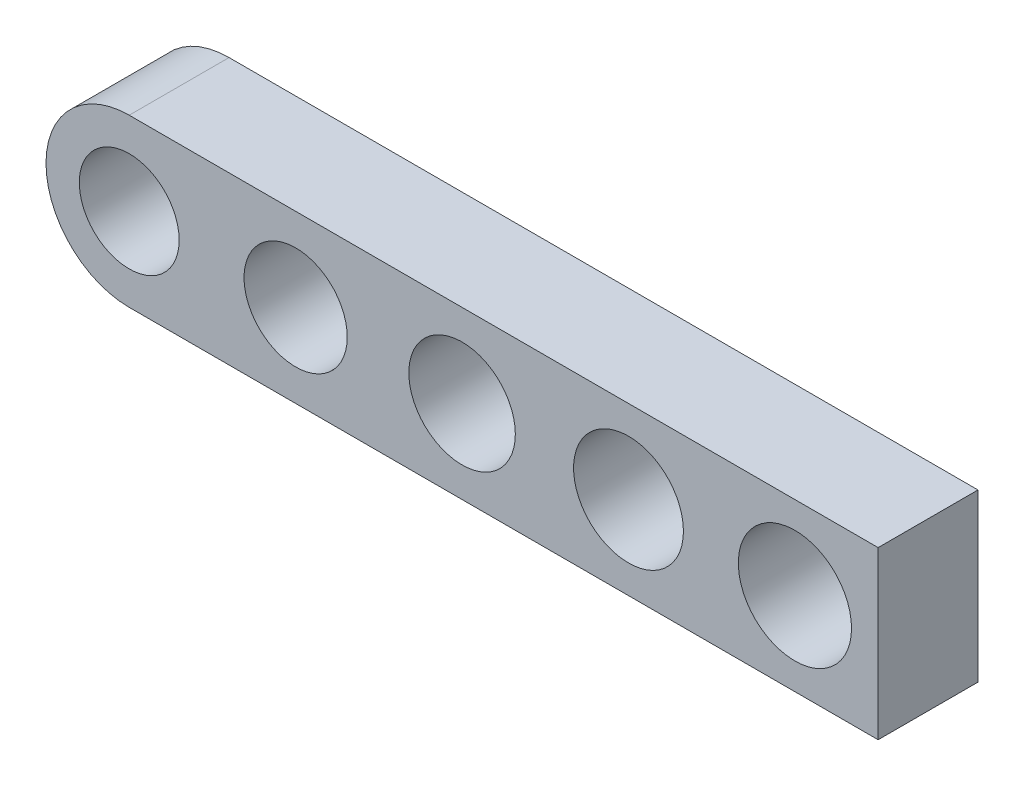
ISO-10303-21;
HEADER;
FILE_DESCRIPTION(('STEP AP214'),'2;1');
FILE_NAME('part.step','',(''),(''),'','','');
FILE_SCHEMA(('AUTOMOTIVE_DESIGN { 1 0 10303 214 1 1 1 1 }'));
ENDSEC;
DATA;
#1=APPLICATION_CONTEXT('core data for automotive mechanical design processes');
#2=APPLICATION_PROTOCOL_DEFINITION('international standard','automotive_design',2000,#1);
#3=PRODUCT_CONTEXT('',#1,'mechanical');
#4=PRODUCT('Part','Part','',(#3));
#5=PRODUCT_RELATED_PRODUCT_CATEGORY('part','',(#4));
#6=PRODUCT_DEFINITION_FORMATION('','',#4);
#7=PRODUCT_DEFINITION_CONTEXT('part definition',#1,'design');
#8=PRODUCT_DEFINITION('design','',#6,#7);
#9=PRODUCT_DEFINITION_SHAPE('','',#8);
#10=(LENGTH_UNIT() NAMED_UNIT(*) SI_UNIT(.MILLI.,.METRE.));
#11=(NAMED_UNIT(*) PLANE_ANGLE_UNIT() SI_UNIT($,.RADIAN.));
#12=(NAMED_UNIT(*) SI_UNIT($,.STERADIAN.) SOLID_ANGLE_UNIT());
#13=UNCERTAINTY_MEASURE_WITH_UNIT(LENGTH_MEASURE(1.E-05),#10,'distance_accuracy_value','');
#14=(GEOMETRIC_REPRESENTATION_CONTEXT(3) GLOBAL_UNCERTAINTY_ASSIGNED_CONTEXT((#13)) GLOBAL_UNIT_ASSIGNED_CONTEXT((#10,
#11,#12)) REPRESENTATION_CONTEXT('',''));
#15=CARTESIAN_POINT('',(0.,0.,0.));
#16=DIRECTION('',(0.,0.,1.));
#17=DIRECTION('',(1.,0.,0.));
#18=AXIS2_PLACEMENT_3D('',#15,#16,#17);
#19=CARTESIAN_POINT('',(0.,0.,3.));
#20=DIRECTION('',(0.,0.,1.));
#21=DIRECTION('',(1.,0.,0.));
#22=AXIS2_PLACEMENT_3D('',#19,#20,#21);
#23=PLANE('',#22);
#24=CARTESIAN_POINT('',(15.,0.,3.));
#25=DIRECTION('',(0.,0.,1.));
#26=DIRECTION('',(1.,0.,0.));
#27=AXIS2_PLACEMENT_3D('',#24,#25,#26);
#28=CIRCLE('',#27,1.65);
#29=CARTESIAN_POINT('',(16.65,0.,3.));
#30=VERTEX_POINT('',#29);
#31=EDGE_CURVE('E148',#30,#30,#28,.T.);
#32=ORIENTED_EDGE('',*,*,#31,.F.);
#33=EDGE_LOOP('',(#32));
#34=FACE_BOUND('',#33,.T.);
#35=CARTESIAN_POINT('',(5.,0.,3.));
#36=DIRECTION('',(0.,0.,1.));
#37=DIRECTION('',(1.,0.,0.));
#38=AXIS2_PLACEMENT_3D('',#35,#36,#37);
#39=CIRCLE('',#38,1.55);
#40=CARTESIAN_POINT('',(6.55,0.,3.));
#41=VERTEX_POINT('',#40);
#42=EDGE_CURVE('E132',#41,#41,#39,.T.);
#43=ORIENTED_EDGE('',*,*,#42,.F.);
#44=EDGE_LOOP('',(#43));
#45=FACE_BOUND('',#44,.T.);
#46=DIRECTION('',(0.,1.,0.));
#47=VECTOR('',#46,1.);
#48=CARTESIAN_POINT('',(22.5,-2.5,3.));
#49=LINE('',#48,#47);
#50=CARTESIAN_POINT('',(22.5,-2.5,3.));
#51=VERTEX_POINT('',#50);
#52=CARTESIAN_POINT('',(22.5,2.5,3.));
#53=VERTEX_POINT('',#52);
#54=EDGE_CURVE('E91',#51,#53,#49,.T.);
#55=ORIENTED_EDGE('',*,*,#54,.T.);
#56=DIRECTION('',(-1.,0.,0.));
#57=VECTOR('',#56,1.);
#58=CARTESIAN_POINT('',(17.5,2.5,3.));
#59=LINE('',#58,#57);
#60=CARTESIAN_POINT('',(0.,2.5,3.));
#61=VERTEX_POINT('',#60);
#62=EDGE_CURVE('E85',#53,#61,#59,.T.);
#63=ORIENTED_EDGE('',*,*,#62,.T.);
#64=CARTESIAN_POINT('',(0.,0.,3.));
#65=DIRECTION('',(0.,0.,1.));
#66=DIRECTION('',(1.,0.,0.));
#67=AXIS2_PLACEMENT_3D('',#64,#65,#66);
#68=CIRCLE('',#67,2.5);
#69=CARTESIAN_POINT('',(0.,-2.5,3.));
#70=VERTEX_POINT('',#69);
#71=EDGE_CURVE('E88',#61,#70,#68,.T.);
#72=ORIENTED_EDGE('',*,*,#71,.T.);
#73=DIRECTION('',(1.,0.,0.));
#74=VECTOR('',#73,1.);
#75=CARTESIAN_POINT('',(0.,-2.5,3.));
#76=LINE('',#75,#74);
#77=EDGE_CURVE('E57',#70,#51,#76,.T.);
#78=ORIENTED_EDGE('',*,*,#77,.T.);
#79=EDGE_LOOP('',(#55,#63,#72,#78));
#80=FACE_BOUND('',#79,.T.);
#81=CARTESIAN_POINT('',(0.,0.,3.));
#82=DIRECTION('',(0.,0.,1.));
#83=DIRECTION('',(1.,0.,0.));
#84=AXIS2_PLACEMENT_3D('',#81,#82,#83);
#85=CIRCLE('',#84,1.5);
#86=CARTESIAN_POINT('',(1.5,0.,3.));
#87=VERTEX_POINT('',#86);
#88=EDGE_CURVE('E113',#87,#87,#85,.T.);
#89=ORIENTED_EDGE('',*,*,#88,.F.);
#90=EDGE_LOOP('',(#89));
#91=FACE_BOUND('',#90,.T.);
#92=CARTESIAN_POINT('',(10.,0.,3.));
#93=DIRECTION('',(0.,0.,1.));
#94=DIRECTION('',(1.,0.,0.));
#95=AXIS2_PLACEMENT_3D('',#92,#93,#94);
#96=CIRCLE('',#95,1.6);
#97=CARTESIAN_POINT('',(11.6,0.,3.));
#98=VERTEX_POINT('',#97);
#99=EDGE_CURVE('E140',#98,#98,#96,.T.);
#100=ORIENTED_EDGE('',*,*,#99,.F.);
#101=EDGE_LOOP('',(#100));
#102=FACE_BOUND('',#101,.T.);
#103=CARTESIAN_POINT('',(20.,0.,3.));
#104=DIRECTION('',(0.,0.,1.));
#105=DIRECTION('',(1.,0.,0.));
#106=AXIS2_PLACEMENT_3D('',#103,#104,#105);
#107=CIRCLE('',#106,1.7);
#108=CARTESIAN_POINT('',(21.7,0.,3.));
#109=VERTEX_POINT('',#108);
#110=EDGE_CURVE('E156',#109,#109,#107,.T.);
#111=ORIENTED_EDGE('',*,*,#110,.F.);
#112=EDGE_LOOP('',(#111));
#113=FACE_BOUND('',#112,.T.);
#114=ADVANCED_FACE('F39',(#34,#45,#80,#91,#102,#113),#23,.T.);
#115=CARTESIAN_POINT('',(0.,0.,0.));
#116=DIRECTION('',(0.,0.,1.));
#117=DIRECTION('',(1.,0.,0.));
#118=AXIS2_PLACEMENT_3D('',#115,#116,#117);
#119=PLANE('',#118);
#120=DIRECTION('',(0.,1.,0.));
#121=VECTOR('',#120,1.);
#122=CARTESIAN_POINT('',(22.5,-2.5,0.));
#123=LINE('',#122,#121);
#124=CARTESIAN_POINT('',(22.5,-2.5,0.));
#125=VERTEX_POINT('',#124);
#126=CARTESIAN_POINT('',(22.5,2.5,0.));
#127=VERTEX_POINT('',#126);
#128=EDGE_CURVE('E109',#125,#127,#123,.T.);
#129=ORIENTED_EDGE('',*,*,#128,.F.);
#130=DIRECTION('',(1.,0.,0.));
#131=VECTOR('',#130,1.);
#132=CARTESIAN_POINT('',(17.5,-2.5,0.));
#133=LINE('',#132,#131);
#134=CARTESIAN_POINT('',(0.,-2.5,0.));
#135=VERTEX_POINT('',#134);
#136=EDGE_CURVE('E74',#135,#125,#133,.T.);
#137=ORIENTED_EDGE('',*,*,#136,.F.);
#138=CARTESIAN_POINT('',(0.,0.,0.));
#139=DIRECTION('',(0.,0.,1.));
#140=DIRECTION('',(1.,0.,0.));
#141=AXIS2_PLACEMENT_3D('',#138,#139,#140);
#142=CIRCLE('',#141,2.5);
#143=CARTESIAN_POINT('',(0.,2.5,0.));
#144=VERTEX_POINT('',#143);
#145=EDGE_CURVE('E116',#144,#135,#142,.T.);
#146=ORIENTED_EDGE('',*,*,#145,.F.);
#147=DIRECTION('',(-1.,0.,0.));
#148=VECTOR('',#147,1.);
#149=CARTESIAN_POINT('',(0.,2.5,0.));
#150=LINE('',#149,#148);
#151=EDGE_CURVE('E97',#127,#144,#150,.T.);
#152=ORIENTED_EDGE('',*,*,#151,.F.);
#153=EDGE_LOOP('',(#129,#137,#146,#152));
#154=FACE_BOUND('',#153,.T.);
#155=CARTESIAN_POINT('',(0.,0.,0.));
#156=DIRECTION('',(0.,0.,1.));
#157=DIRECTION('',(1.,0.,0.));
#158=AXIS2_PLACEMENT_3D('',#155,#156,#157);
#159=CIRCLE('',#158,1.5);
#160=CARTESIAN_POINT('',(1.5,0.,0.));
#161=VERTEX_POINT('',#160);
#162=EDGE_CURVE('E128',#161,#161,#159,.T.);
#163=ORIENTED_EDGE('',*,*,#162,.T.);
#164=EDGE_LOOP('',(#163));
#165=FACE_BOUND('',#164,.T.);
#166=CARTESIAN_POINT('',(5.,0.,0.));
#167=DIRECTION('',(0.,0.,1.));
#168=DIRECTION('',(1.,0.,0.));
#169=AXIS2_PLACEMENT_3D('',#166,#167,#168);
#170=CIRCLE('',#169,1.55);
#171=CARTESIAN_POINT('',(6.55,0.,0.));
#172=VERTEX_POINT('',#171);
#173=EDGE_CURVE('E136',#172,#172,#170,.T.);
#174=ORIENTED_EDGE('',*,*,#173,.T.);
#175=EDGE_LOOP('',(#174));
#176=FACE_BOUND('',#175,.T.);
#177=CARTESIAN_POINT('',(10.,0.,0.));
#178=DIRECTION('',(0.,0.,1.));
#179=DIRECTION('',(1.,0.,0.));
#180=AXIS2_PLACEMENT_3D('',#177,#178,#179);
#181=CIRCLE('',#180,1.6);
#182=CARTESIAN_POINT('',(11.6,0.,0.));
#183=VERTEX_POINT('',#182);
#184=EDGE_CURVE('E144',#183,#183,#181,.T.);
#185=ORIENTED_EDGE('',*,*,#184,.T.);
#186=EDGE_LOOP('',(#185));
#187=FACE_BOUND('',#186,.T.);
#188=CARTESIAN_POINT('',(15.,0.,0.));
#189=DIRECTION('',(0.,0.,1.));
#190=DIRECTION('',(1.,0.,0.));
#191=AXIS2_PLACEMENT_3D('',#188,#189,#190);
#192=CIRCLE('',#191,1.65);
#193=CARTESIAN_POINT('',(16.65,0.,0.));
#194=VERTEX_POINT('',#193);
#195=EDGE_CURVE('E152',#194,#194,#192,.T.);
#196=ORIENTED_EDGE('',*,*,#195,.T.);
#197=EDGE_LOOP('',(#196));
#198=FACE_BOUND('',#197,.T.);
#199=CARTESIAN_POINT('',(20.,0.,0.));
#200=DIRECTION('',(0.,0.,1.));
#201=DIRECTION('',(1.,0.,0.));
#202=AXIS2_PLACEMENT_3D('',#199,#200,#201);
#203=CIRCLE('',#202,1.7);
#204=CARTESIAN_POINT('',(21.7,0.,0.));
#205=VERTEX_POINT('',#204);
#206=EDGE_CURVE('E160',#205,#205,#203,.T.);
#207=ORIENTED_EDGE('',*,*,#206,.T.);
#208=EDGE_LOOP('',(#207));
#209=FACE_BOUND('',#208,.T.);
#210=ADVANCED_FACE('F172',(#154,#165,#176,#187,#198,#209),#119,.F.);
#211=CARTESIAN_POINT('',(22.5,-2.5,3.));
#212=DIRECTION('',(-1.,0.,0.));
#213=DIRECTION('',(0.,0.,1.));
#214=AXIS2_PLACEMENT_3D('',#211,#212,#213);
#215=PLANE('',#214);
#216=ORIENTED_EDGE('',*,*,#128,.T.);
#217=DIRECTION('',(0.,0.,-1.));
#218=VECTOR('',#217,1.);
#219=CARTESIAN_POINT('',(22.5,2.5,3.));
#220=LINE('',#219,#218);
#221=EDGE_CURVE('E11',#53,#127,#220,.T.);
#222=ORIENTED_EDGE('',*,*,#221,.F.);
#223=ORIENTED_EDGE('',*,*,#54,.F.);
#224=DIRECTION('',(0.,0.,-1.));
#225=VECTOR('',#224,1.);
#226=CARTESIAN_POINT('',(22.5,-2.5,3.));
#227=LINE('',#226,#225);
#228=EDGE_CURVE('E105',#51,#125,#227,.T.);
#229=ORIENTED_EDGE('',*,*,#228,.T.);
#230=EDGE_LOOP('',(#216,#222,#223,#229));
#231=FACE_BOUND('',#230,.T.);
#232=ADVANCED_FACE('F41',(#231),#215,.F.);
#233=CARTESIAN_POINT('',(0.,2.5,3.));
#234=DIRECTION('',(0.,-1.,0.));
#235=DIRECTION('',(1.,0.,0.));
#236=AXIS2_PLACEMENT_3D('',#233,#234,#235);
#237=PLANE('',#236);
#238=ORIENTED_EDGE('',*,*,#151,.T.);
#239=DIRECTION('',(0.,0.,-1.));
#240=VECTOR('',#239,1.);
#241=CARTESIAN_POINT('',(0.,2.5,3.));
#242=LINE('',#241,#240);
#243=EDGE_CURVE('E49',#61,#144,#242,.T.);
#244=ORIENTED_EDGE('',*,*,#243,.F.);
#245=ORIENTED_EDGE('',*,*,#62,.F.);
#246=ORIENTED_EDGE('',*,*,#221,.T.);
#247=EDGE_LOOP('',(#238,#244,#245,#246));
#248=FACE_BOUND('',#247,.T.);
#249=ADVANCED_FACE('F96',(#248),#237,.F.);
#250=CARTESIAN_POINT('',(0.,0.,3.));
#251=DIRECTION('',(0.,0.,-1.));
#252=DIRECTION('',(-1.,0.,0.));
#253=AXIS2_PLACEMENT_3D('',#250,#251,#252);
#254=CYLINDRICAL_SURFACE('',#253,2.5);
#255=ORIENTED_EDGE('',*,*,#145,.T.);
#256=DIRECTION('',(0.,0.,-1.));
#257=VECTOR('',#256,1.);
#258=CARTESIAN_POINT('',(0.,-2.5,3.));
#259=LINE('',#258,#257);
#260=EDGE_CURVE('E100',#70,#135,#259,.T.);
#261=ORIENTED_EDGE('',*,*,#260,.F.);
#262=ORIENTED_EDGE('',*,*,#71,.F.);
#263=ORIENTED_EDGE('',*,*,#243,.T.);
#264=EDGE_LOOP('',(#255,#261,#262,#263));
#265=FACE_BOUND('',#264,.T.);
#266=ADVANCED_FACE('F101',(#265),#254,.T.);
#267=CARTESIAN_POINT('',(17.5,-2.5,3.));
#268=DIRECTION('',(0.,1.,0.));
#269=DIRECTION('',(-1.,0.,0.));
#270=AXIS2_PLACEMENT_3D('',#267,#268,#269);
#271=PLANE('',#270);
#272=ORIENTED_EDGE('',*,*,#136,.T.);
#273=ORIENTED_EDGE('',*,*,#228,.F.);
#274=ORIENTED_EDGE('',*,*,#77,.F.);
#275=ORIENTED_EDGE('',*,*,#260,.T.);
#276=EDGE_LOOP('',(#272,#273,#274,#275));
#277=FACE_BOUND('',#276,.T.);
#278=ADVANCED_FACE('F124',(#277),#271,.F.);
#279=CARTESIAN_POINT('',(0.,0.,3.));
#280=DIRECTION('',(0.,0.,-1.));
#281=DIRECTION('',(-1.,0.,0.));
#282=AXIS2_PLACEMENT_3D('',#279,#280,#281);
#283=CYLINDRICAL_SURFACE('',#282,1.5);
#284=ORIENTED_EDGE('',*,*,#88,.T.);
#285=EDGE_LOOP('',(#284));
#286=FACE_BOUND('',#285,.T.);
#287=ORIENTED_EDGE('',*,*,#162,.F.);
#288=EDGE_LOOP('',(#287));
#289=FACE_BOUND('',#288,.T.);
#290=ADVANCED_FACE('F182',(#286,#289),#283,.F.);
#291=CARTESIAN_POINT('',(5.,0.,3.));
#292=DIRECTION('',(0.,0.,-1.));
#293=DIRECTION('',(-1.,0.,0.));
#294=AXIS2_PLACEMENT_3D('',#291,#292,#293);
#295=CYLINDRICAL_SURFACE('',#294,1.55);
#296=ORIENTED_EDGE('',*,*,#42,.T.);
#297=EDGE_LOOP('',(#296));
#298=FACE_BOUND('',#297,.T.);
#299=ORIENTED_EDGE('',*,*,#173,.F.);
#300=EDGE_LOOP('',(#299));
#301=FACE_BOUND('',#300,.T.);
#302=ADVANCED_FACE('F234',(#298,#301),#295,.F.);
#303=CARTESIAN_POINT('',(10.,0.,3.));
#304=DIRECTION('',(0.,0.,-1.));
#305=DIRECTION('',(-1.,0.,0.));
#306=AXIS2_PLACEMENT_3D('',#303,#304,#305);
#307=CYLINDRICAL_SURFACE('',#306,1.6);
#308=ORIENTED_EDGE('',*,*,#99,.T.);
#309=EDGE_LOOP('',(#308));
#310=FACE_BOUND('',#309,.T.);
#311=ORIENTED_EDGE('',*,*,#184,.F.);
#312=EDGE_LOOP('',(#311));
#313=FACE_BOUND('',#312,.T.);
#314=ADVANCED_FACE('F242',(#310,#313),#307,.F.);
#315=CARTESIAN_POINT('',(15.,0.,3.));
#316=DIRECTION('',(0.,0.,-1.));
#317=DIRECTION('',(-1.,0.,0.));
#318=AXIS2_PLACEMENT_3D('',#315,#316,#317);
#319=CYLINDRICAL_SURFACE('',#318,1.65);
#320=ORIENTED_EDGE('',*,*,#31,.T.);
#321=EDGE_LOOP('',(#320));
#322=FACE_BOUND('',#321,.T.);
#323=ORIENTED_EDGE('',*,*,#195,.F.);
#324=EDGE_LOOP('',(#323));
#325=FACE_BOUND('',#324,.T.);
#326=ADVANCED_FACE('F250',(#322,#325),#319,.F.);
#327=CARTESIAN_POINT('',(20.,0.,3.));
#328=DIRECTION('',(0.,0.,-1.));
#329=DIRECTION('',(-1.,0.,0.));
#330=AXIS2_PLACEMENT_3D('',#327,#328,#329);
#331=CYLINDRICAL_SURFACE('',#330,1.7);
#332=ORIENTED_EDGE('',*,*,#110,.T.);
#333=EDGE_LOOP('',(#332));
#334=FACE_BOUND('',#333,.T.);
#335=ORIENTED_EDGE('',*,*,#206,.F.);
#336=EDGE_LOOP('',(#335));
#337=FACE_BOUND('',#336,.T.);
#338=ADVANCED_FACE('F168',(#334,#337),#331,.F.);
#339=CLOSED_SHELL('',(#114,#210,#232,#249,#266,#278,#290,#302,#314,#326,#338));
#340=MANIFOLD_SOLID_BREP('B2',#339);
#341=ADVANCED_BREP_SHAPE_REPRESENTATION('',(#18,#340),#14);
#342=SHAPE_DEFINITION_REPRESENTATION(#9,#341);
ENDSEC;
END-ISO-10303-21;
